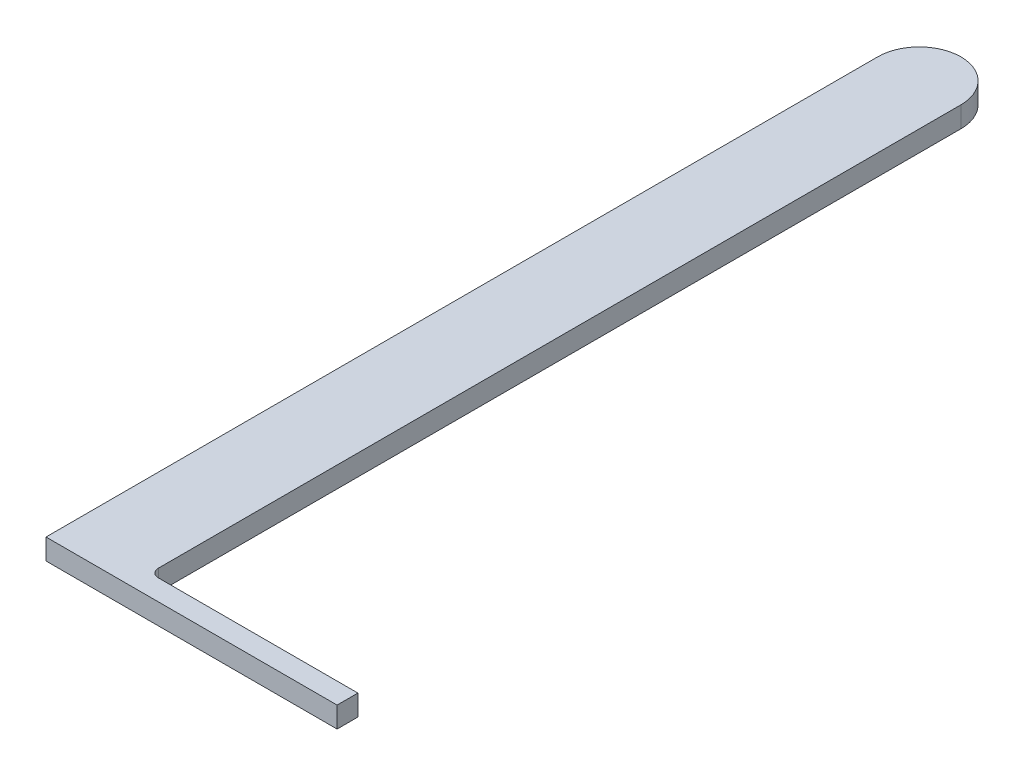
ISO-10303-21;
HEADER;
FILE_DESCRIPTION(('STEP AP214'),'2;1');
FILE_NAME('part.step','',(''),(''),'','','');
FILE_SCHEMA(('AUTOMOTIVE_DESIGN { 1 0 10303 214 1 1 1 1 }'));
ENDSEC;
DATA;
#1=APPLICATION_CONTEXT('core data for automotive mechanical design processes');
#2=APPLICATION_PROTOCOL_DEFINITION('international standard','automotive_design',2000,#1);
#3=PRODUCT_CONTEXT('',#1,'mechanical');
#4=PRODUCT('Part','Part','',(#3));
#5=PRODUCT_RELATED_PRODUCT_CATEGORY('part','',(#4));
#6=PRODUCT_DEFINITION_FORMATION('','',#4);
#7=PRODUCT_DEFINITION_CONTEXT('part definition',#1,'design');
#8=PRODUCT_DEFINITION('design','',#6,#7);
#9=PRODUCT_DEFINITION_SHAPE('','',#8);
#10=(LENGTH_UNIT() NAMED_UNIT(*) SI_UNIT(.MILLI.,.METRE.));
#11=(NAMED_UNIT(*) PLANE_ANGLE_UNIT() SI_UNIT($,.RADIAN.));
#12=(NAMED_UNIT(*) SI_UNIT($,.STERADIAN.) SOLID_ANGLE_UNIT());
#13=UNCERTAINTY_MEASURE_WITH_UNIT(LENGTH_MEASURE(1.E-05),#10,'distance_accuracy_value','');
#14=(GEOMETRIC_REPRESENTATION_CONTEXT(3) GLOBAL_UNCERTAINTY_ASSIGNED_CONTEXT((#13)) GLOBAL_UNIT_ASSIGNED_CONTEXT((#10,
#11,#12)) REPRESENTATION_CONTEXT('',''));
#15=CARTESIAN_POINT('',(0.,0.,0.));
#16=DIRECTION('',(0.,0.,1.));
#17=DIRECTION('',(1.,0.,0.));
#18=AXIS2_PLACEMENT_3D('',#15,#16,#17);
#19=CARTESIAN_POINT('',(12.7,6.35,0.));
#20=DIRECTION('',(1.,0.,0.));
#21=DIRECTION('',(0.,0.,-1.));
#22=AXIS2_PLACEMENT_3D('',#19,#20,#21);
#23=PLANE('',#22);
#24=DIRECTION('',(0.,0.,1.));
#25=VECTOR('',#24,1.);
#26=CARTESIAN_POINT('',(12.7,6.35,0.));
#27=LINE('',#26,#25);
#28=CARTESIAN_POINT('',(12.7,6.35,0.));
#29=VERTEX_POINT('',#28);
#30=CARTESIAN_POINT('',(12.7,6.35,245.11));
#31=VERTEX_POINT('',#30);
#32=EDGE_CURVE('E136',#29,#31,#27,.T.);
#33=ORIENTED_EDGE('',*,*,#32,.T.);
#34=DIRECTION('',(0.,-1.,0.));
#35=VECTOR('',#34,1.);
#36=CARTESIAN_POINT('',(12.7,0.,245.11));
#37=LINE('',#36,#35);
#38=CARTESIAN_POINT('',(12.7,0.,245.11));
#39=VERTEX_POINT('',#38);
#40=EDGE_CURVE('E145',#31,#39,#37,.T.);
#41=ORIENTED_EDGE('',*,*,#40,.T.);
#42=DIRECTION('',(0.,0.,1.));
#43=VECTOR('',#42,1.);
#44=CARTESIAN_POINT('',(12.7,0.,0.));
#45=LINE('',#44,#43);
#46=CARTESIAN_POINT('',(12.7,0.,0.));
#47=VERTEX_POINT('',#46);
#48=EDGE_CURVE('E140',#47,#39,#45,.T.);
#49=ORIENTED_EDGE('',*,*,#48,.F.);
#50=DIRECTION('',(0.,-1.,0.));
#51=VECTOR('',#50,1.);
#52=CARTESIAN_POINT('',(12.7,6.35,0.));
#53=LINE('',#52,#51);
#54=EDGE_CURVE('E143',#29,#47,#53,.T.);
#55=ORIENTED_EDGE('',*,*,#54,.F.);
#56=EDGE_LOOP('',(#33,#41,#49,#55));
#57=FACE_BOUND('',#56,.T.);
#58=ADVANCED_FACE('F35',(#57),#23,.T.);
#59=CARTESIAN_POINT('',(0.,6.35,0.));
#60=DIRECTION('',(0.,-1.,0.));
#61=DIRECTION('',(0.,0.,-1.));
#62=AXIS2_PLACEMENT_3D('',#59,#60,#61);
#63=CYLINDRICAL_SURFACE('',#62,12.7);
#64=CARTESIAN_POINT('',(0.,0.,0.));
#65=DIRECTION('',(0.,1.,0.));
#66=DIRECTION('',(0.,0.,1.));
#67=AXIS2_PLACEMENT_3D('',#64,#65,#66);
#68=CIRCLE('',#67,12.7);
#69=CARTESIAN_POINT('',(-12.7,0.,0.));
#70=VERTEX_POINT('',#69);
#71=EDGE_CURVE('E138',#47,#70,#68,.T.);
#72=ORIENTED_EDGE('',*,*,#71,.T.);
#73=DIRECTION('',(0.,-1.,0.));
#74=VECTOR('',#73,1.);
#75=CARTESIAN_POINT('',(-12.7,6.35,0.));
#76=LINE('',#75,#74);
#77=CARTESIAN_POINT('',(-12.7,6.35,0.));
#78=VERTEX_POINT('',#77);
#79=EDGE_CURVE('E105',#78,#70,#76,.T.);
#80=ORIENTED_EDGE('',*,*,#79,.F.);
#81=CARTESIAN_POINT('',(0.,6.35,0.));
#82=DIRECTION('',(0.,1.,0.));
#83=DIRECTION('',(0.,0.,1.));
#84=AXIS2_PLACEMENT_3D('',#81,#82,#83);
#85=CIRCLE('',#84,12.7);
#86=EDGE_CURVE('E101',#29,#78,#85,.T.);
#87=ORIENTED_EDGE('',*,*,#86,.F.);
#88=ORIENTED_EDGE('',*,*,#54,.T.);
#89=EDGE_LOOP('',(#72,#80,#87,#88));
#90=FACE_BOUND('',#89,.T.);
#91=ADVANCED_FACE('F174',(#90),#63,.T.);
#92=CARTESIAN_POINT('',(-12.7,6.35,0.));
#93=DIRECTION('',(1.,0.,0.));
#94=DIRECTION('',(0.,0.,-1.));
#95=AXIS2_PLACEMENT_3D('',#92,#93,#94);
#96=PLANE('',#95);
#97=DIRECTION('',(0.,0.,1.));
#98=VECTOR('',#97,1.);
#99=CARTESIAN_POINT('',(-12.7,0.,0.));
#100=LINE('',#99,#98);
#101=CARTESIAN_POINT('',(-12.7,0.,254.));
#102=VERTEX_POINT('',#101);
#103=EDGE_CURVE('E111',#70,#102,#100,.T.);
#104=ORIENTED_EDGE('',*,*,#103,.T.);
#105=DIRECTION('',(0.,1.,0.));
#106=VECTOR('',#105,1.);
#107=CARTESIAN_POINT('',(-12.7,-89.1264971823756,254.));
#108=LINE('',#107,#106);
#109=CARTESIAN_POINT('',(-12.7,6.35,254.));
#110=VERTEX_POINT('',#109);
#111=EDGE_CURVE('E108',#102,#110,#108,.T.);
#112=ORIENTED_EDGE('',*,*,#111,.T.);
#113=DIRECTION('',(0.,0.,1.));
#114=VECTOR('',#113,1.);
#115=CARTESIAN_POINT('',(-12.7,6.35,0.));
#116=LINE('',#115,#114);
#117=EDGE_CURVE('E93',#78,#110,#116,.T.);
#118=ORIENTED_EDGE('',*,*,#117,.F.);
#119=ORIENTED_EDGE('',*,*,#79,.T.);
#120=EDGE_LOOP('',(#104,#112,#118,#119));
#121=FACE_BOUND('',#120,.T.);
#122=ADVANCED_FACE('F109',(#121),#96,.F.);
#123=CARTESIAN_POINT('',(0.,6.35,0.));
#124=DIRECTION('',(0.,1.,0.));
#125=DIRECTION('',(0.,0.,1.));
#126=AXIS2_PLACEMENT_3D('',#123,#124,#125);
#127=PLANE('',#126);
#128=ORIENTED_EDGE('',*,*,#32,.F.);
#129=ORIENTED_EDGE('',*,*,#86,.T.);
#130=ORIENTED_EDGE('',*,*,#117,.T.);
#131=DIRECTION('',(1.,0.,0.));
#132=VECTOR('',#131,1.);
#133=CARTESIAN_POINT('',(-12.7,6.35,254.));
#134=LINE('',#133,#132);
#135=CARTESIAN_POINT('',(76.2,6.35,254.));
#136=VERTEX_POINT('',#135);
#137=EDGE_CURVE('E99',#110,#136,#134,.T.);
#138=ORIENTED_EDGE('',*,*,#137,.T.);
#139=DIRECTION('',(0.,0.,-1.));
#140=VECTOR('',#139,1.);
#141=CARTESIAN_POINT('',(76.2,6.35,247.65));
#142=LINE('',#141,#140);
#143=CARTESIAN_POINT('',(76.2,6.35,247.65));
#144=VERTEX_POINT('',#143);
#145=EDGE_CURVE('E121',#136,#144,#142,.T.);
#146=ORIENTED_EDGE('',*,*,#145,.T.);
#147=DIRECTION('',(-1.,0.,0.));
#148=VECTOR('',#147,1.);
#149=CARTESIAN_POINT('',(-12.7,6.35,247.65));
#150=LINE('',#149,#148);
#151=CARTESIAN_POINT('',(15.24,6.35,247.65));
#152=VERTEX_POINT('',#151);
#153=EDGE_CURVE('E116',#144,#152,#150,.T.);
#154=ORIENTED_EDGE('',*,*,#153,.T.);
#155=CARTESIAN_POINT('',(15.24,6.35,245.11));
#156=DIRECTION('',(0.,1.,0.));
#157=DIRECTION('',(0.,0.,1.));
#158=AXIS2_PLACEMENT_3D('',#155,#156,#157);
#159=CIRCLE('',#158,2.54);
#160=EDGE_CURVE('E11',#152,#31,#159,.F.);
#161=ORIENTED_EDGE('',*,*,#160,.T.);
#162=EDGE_LOOP('',(#128,#129,#130,#138,#146,#154,#161));
#163=FACE_BOUND('',#162,.T.);
#164=ADVANCED_FACE('F96',(#163),#127,.T.);
#165=CARTESIAN_POINT('',(0.,0.,0.));
#166=DIRECTION('',(0.,1.,0.));
#167=DIRECTION('',(0.,0.,1.));
#168=AXIS2_PLACEMENT_3D('',#165,#166,#167);
#169=PLANE('',#168);
#170=ORIENTED_EDGE('',*,*,#48,.T.);
#171=CARTESIAN_POINT('',(15.24,0.,245.11));
#172=DIRECTION('',(0.,1.,0.));
#173=DIRECTION('',(0.,0.,1.));
#174=AXIS2_PLACEMENT_3D('',#171,#172,#173);
#175=CIRCLE('',#174,2.54);
#176=CARTESIAN_POINT('',(15.24,0.,247.65));
#177=VERTEX_POINT('',#176);
#178=EDGE_CURVE('E43',#39,#177,#175,.T.);
#179=ORIENTED_EDGE('',*,*,#178,.T.);
#180=DIRECTION('',(1.,0.,0.));
#181=VECTOR('',#180,1.);
#182=CARTESIAN_POINT('',(-12.7,0.,247.65));
#183=LINE('',#182,#181);
#184=CARTESIAN_POINT('',(76.2,0.,247.65));
#185=VERTEX_POINT('',#184);
#186=EDGE_CURVE('E155',#177,#185,#183,.T.);
#187=ORIENTED_EDGE('',*,*,#186,.T.);
#188=DIRECTION('',(0.,0.,1.));
#189=VECTOR('',#188,1.);
#190=CARTESIAN_POINT('',(76.2,0.,247.65));
#191=LINE('',#190,#189);
#192=CARTESIAN_POINT('',(76.2,0.,254.));
#193=VERTEX_POINT('',#192);
#194=EDGE_CURVE('E157',#185,#193,#191,.T.);
#195=ORIENTED_EDGE('',*,*,#194,.T.);
#196=DIRECTION('',(-1.,0.,0.));
#197=VECTOR('',#196,1.);
#198=CARTESIAN_POINT('',(-12.7,0.,254.));
#199=LINE('',#198,#197);
#200=EDGE_CURVE('E135',#193,#102,#199,.T.);
#201=ORIENTED_EDGE('',*,*,#200,.T.);
#202=ORIENTED_EDGE('',*,*,#103,.F.);
#203=ORIENTED_EDGE('',*,*,#71,.F.);
#204=EDGE_LOOP('',(#170,#179,#187,#195,#201,#202,#203));
#205=FACE_BOUND('',#204,.T.);
#206=ADVANCED_FACE('F165',(#205),#169,.F.);
#207=CARTESIAN_POINT('',(-12.7,-89.1264971823756,247.65));
#208=DIRECTION('',(0.,0.,-1.));
#209=DIRECTION('',(-1.,0.,0.));
#210=AXIS2_PLACEMENT_3D('',#207,#208,#209);
#211=PLANE('',#210);
#212=ORIENTED_EDGE('',*,*,#186,.F.);
#213=DIRECTION('',(0.,-1.,0.));
#214=VECTOR('',#213,1.);
#215=CARTESIAN_POINT('',(15.24,6.35,247.65));
#216=LINE('',#215,#214);
#217=EDGE_CURVE('E56',#177,#152,#216,.F.);
#218=ORIENTED_EDGE('',*,*,#217,.T.);
#219=ORIENTED_EDGE('',*,*,#153,.F.);
#220=DIRECTION('',(0.,1.,0.));
#221=VECTOR('',#220,1.);
#222=CARTESIAN_POINT('',(76.2,-89.1264971823756,247.65));
#223=LINE('',#222,#221);
#224=EDGE_CURVE('E130',#185,#144,#223,.T.);
#225=ORIENTED_EDGE('',*,*,#224,.F.);
#226=EDGE_LOOP('',(#212,#218,#219,#225));
#227=FACE_BOUND('',#226,.T.);
#228=ADVANCED_FACE('F163',(#227),#211,.T.);
#229=CARTESIAN_POINT('',(76.2,-89.1264971823756,247.65));
#230=DIRECTION('',(1.,0.,0.));
#231=DIRECTION('',(0.,0.,-1.));
#232=AXIS2_PLACEMENT_3D('',#229,#230,#231);
#233=PLANE('',#232);
#234=ORIENTED_EDGE('',*,*,#194,.F.);
#235=ORIENTED_EDGE('',*,*,#224,.T.);
#236=ORIENTED_EDGE('',*,*,#145,.F.);
#237=DIRECTION('',(0.,1.,0.));
#238=VECTOR('',#237,1.);
#239=CARTESIAN_POINT('',(76.2,-89.1264971823756,254.));
#240=LINE('',#239,#238);
#241=EDGE_CURVE('E115',#193,#136,#240,.T.);
#242=ORIENTED_EDGE('',*,*,#241,.F.);
#243=EDGE_LOOP('',(#234,#235,#236,#242));
#244=FACE_BOUND('',#243,.T.);
#245=ADVANCED_FACE('F161',(#244),#233,.T.);
#246=CARTESIAN_POINT('',(-12.7,-89.1264971823756,254.));
#247=DIRECTION('',(0.,0.,1.));
#248=DIRECTION('',(1.,0.,0.));
#249=AXIS2_PLACEMENT_3D('',#246,#247,#248);
#250=PLANE('',#249);
#251=ORIENTED_EDGE('',*,*,#200,.F.);
#252=ORIENTED_EDGE('',*,*,#241,.T.);
#253=ORIENTED_EDGE('',*,*,#137,.F.);
#254=ORIENTED_EDGE('',*,*,#111,.F.);
#255=EDGE_LOOP('',(#251,#252,#253,#254));
#256=FACE_BOUND('',#255,.T.);
#257=ADVANCED_FACE('F118',(#256),#250,.T.);
#258=CARTESIAN_POINT('',(15.24,6.35,245.11));
#259=DIRECTION('',(0.,1.,0.));
#260=DIRECTION('',(0.,0.,1.));
#261=AXIS2_PLACEMENT_3D('',#258,#259,#260);
#262=CYLINDRICAL_SURFACE('',#261,2.54);
#263=ORIENTED_EDGE('',*,*,#160,.F.);
#264=ORIENTED_EDGE('',*,*,#217,.F.);
#265=ORIENTED_EDGE('',*,*,#178,.F.);
#266=ORIENTED_EDGE('',*,*,#40,.F.);
#267=EDGE_LOOP('',(#263,#264,#265,#266));
#268=FACE_BOUND('',#267,.T.);
#269=ADVANCED_FACE('F37',(#268),#262,.F.);
#270=CLOSED_SHELL('',(#58,#91,#122,#164,#206,#228,#245,#257,#269));
#271=MANIFOLD_SOLID_BREP('B2',#270);
#272=ADVANCED_BREP_SHAPE_REPRESENTATION('',(#18,#271),#14);
#273=SHAPE_DEFINITION_REPRESENTATION(#9,#272);
ENDSEC;
END-ISO-10303-21;
